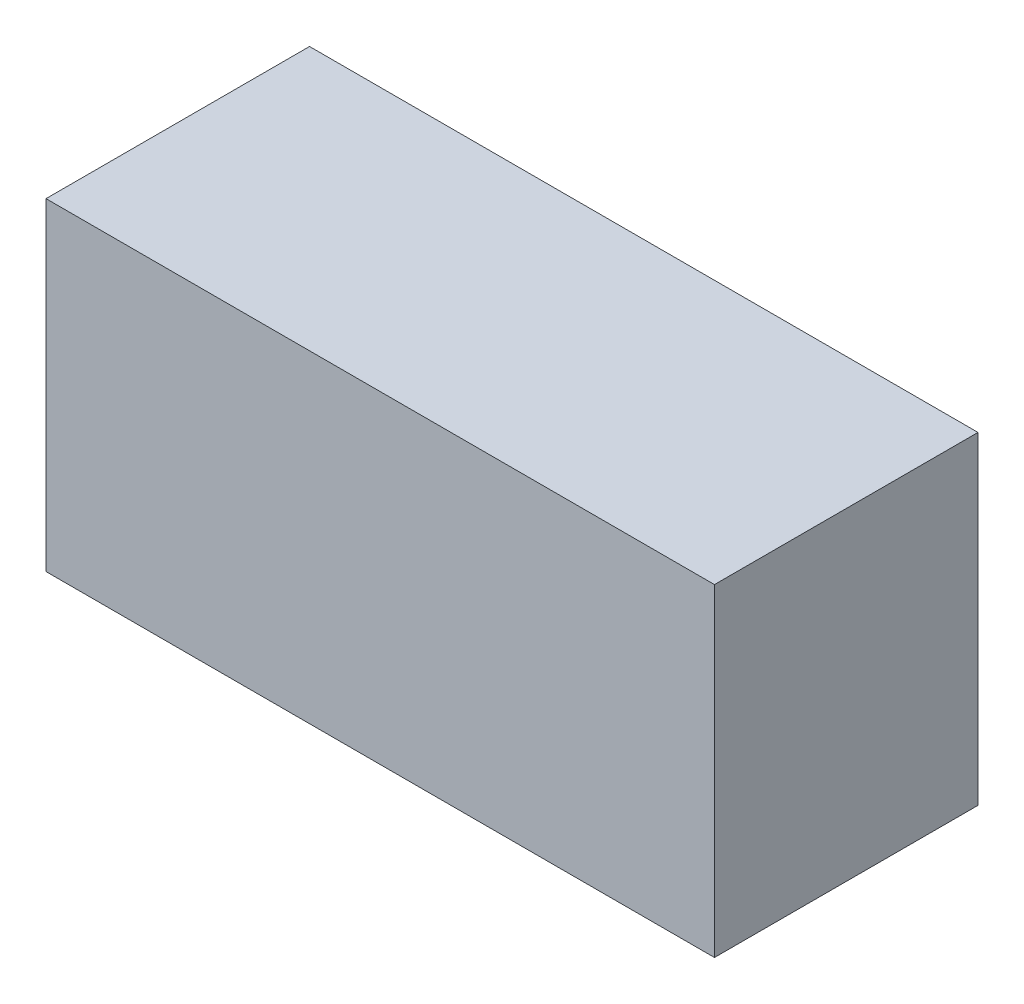
ISO-10303-21;
HEADER;
FILE_DESCRIPTION(('STEP AP214'),'2;1');
FILE_NAME('part.step','',(''),(''),'','','');
FILE_SCHEMA(('AUTOMOTIVE_DESIGN { 1 0 10303 214 1 1 1 1 }'));
ENDSEC;
DATA;
#1=APPLICATION_CONTEXT('core data for automotive mechanical design processes');
#2=APPLICATION_PROTOCOL_DEFINITION('international standard','automotive_design',2000,#1);
#3=PRODUCT_CONTEXT('',#1,'mechanical');
#4=PRODUCT('Part','Part','',(#3));
#5=PRODUCT_RELATED_PRODUCT_CATEGORY('part','',(#4));
#6=PRODUCT_DEFINITION_FORMATION('','',#4);
#7=PRODUCT_DEFINITION_CONTEXT('part definition',#1,'design');
#8=PRODUCT_DEFINITION('design','',#6,#7);
#9=PRODUCT_DEFINITION_SHAPE('','',#8);
#10=(LENGTH_UNIT() NAMED_UNIT(*) SI_UNIT(.MILLI.,.METRE.));
#11=(NAMED_UNIT(*) PLANE_ANGLE_UNIT() SI_UNIT($,.RADIAN.));
#12=(NAMED_UNIT(*) SI_UNIT($,.STERADIAN.) SOLID_ANGLE_UNIT());
#13=UNCERTAINTY_MEASURE_WITH_UNIT(LENGTH_MEASURE(1.E-05),#10,'distance_accuracy_value','');
#14=(GEOMETRIC_REPRESENTATION_CONTEXT(3) GLOBAL_UNCERTAINTY_ASSIGNED_CONTEXT((#13)) GLOBAL_UNIT_ASSIGNED_CONTEXT((#10,
#11,#12)) REPRESENTATION_CONTEXT('',''));
#15=CARTESIAN_POINT('',(0.,0.,0.));
#16=DIRECTION('',(0.,0.,1.));
#17=DIRECTION('',(1.,0.,0.));
#18=AXIS2_PLACEMENT_3D('',#15,#16,#17);
#19=CARTESIAN_POINT('',(0.,10.55,0.));
#20=DIRECTION('',(0.,1.,0.));
#21=DIRECTION('',(1.,0.,0.));
#22=AXIS2_PLACEMENT_3D('',#19,#20,#21);
#23=PLANE('',#22);
#24=DIRECTION('',(1.,0.,0.));
#25=VECTOR('',#24,1.);
#26=CARTESIAN_POINT('',(5.2,10.55,-4.1));
#27=LINE('',#26,#25);
#28=CARTESIAN_POINT('',(-10.4,10.55,-4.1));
#29=VERTEX_POINT('',#28);
#30=CARTESIAN_POINT('',(10.4,10.55,-4.1));
#31=VERTEX_POINT('',#30);
#32=EDGE_CURVE('E106',#29,#31,#27,.T.);
#33=ORIENTED_EDGE('',*,*,#32,.F.);
#34=DIRECTION('',(0.,0.,-1.));
#35=VECTOR('',#34,1.);
#36=CARTESIAN_POINT('',(-10.4,10.55,-2.05));
#37=LINE('',#36,#35);
#38=CARTESIAN_POINT('',(-10.4,10.55,4.1));
#39=VERTEX_POINT('',#38);
#40=EDGE_CURVE('E92',#39,#29,#37,.T.);
#41=ORIENTED_EDGE('',*,*,#40,.F.);
#42=DIRECTION('',(-1.,0.,0.));
#43=VECTOR('',#42,1.);
#44=CARTESIAN_POINT('',(-5.2,10.55,4.1));
#45=LINE('',#44,#43);
#46=CARTESIAN_POINT('',(10.4,10.55,4.1));
#47=VERTEX_POINT('',#46);
#48=EDGE_CURVE('E89',#47,#39,#45,.T.);
#49=ORIENTED_EDGE('',*,*,#48,.F.);
#50=DIRECTION('',(0.,0.,1.));
#51=VECTOR('',#50,1.);
#52=CARTESIAN_POINT('',(10.4,10.55,2.05));
#53=LINE('',#52,#51);
#54=EDGE_CURVE('E26',#31,#47,#53,.T.);
#55=ORIENTED_EDGE('',*,*,#54,.F.);
#56=EDGE_LOOP('',(#33,#41,#49,#55));
#57=FACE_BOUND('',#56,.T.);
#58=ADVANCED_FACE('F16',(#57),#23,.T.);
#59=CARTESIAN_POINT('',(0.,0.5,0.));
#60=DIRECTION('',(0.,1.,0.));
#61=DIRECTION('',(1.,0.,0.));
#62=AXIS2_PLACEMENT_3D('',#59,#60,#61);
#63=PLANE('',#62);
#64=DIRECTION('',(0.,0.,-1.));
#65=VECTOR('',#64,1.);
#66=CARTESIAN_POINT('',(-10.4,0.5,4.1));
#67=LINE('',#66,#65);
#68=CARTESIAN_POINT('',(-10.4,0.5,4.1));
#69=VERTEX_POINT('',#68);
#70=CARTESIAN_POINT('',(-10.4,0.5,-4.1));
#71=VERTEX_POINT('',#70);
#72=EDGE_CURVE('E73',#69,#71,#67,.T.);
#73=ORIENTED_EDGE('',*,*,#72,.T.);
#74=DIRECTION('',(1.,0.,0.));
#75=VECTOR('',#74,1.);
#76=CARTESIAN_POINT('',(-10.4,0.5,-4.1));
#77=LINE('',#76,#75);
#78=CARTESIAN_POINT('',(10.4,0.5,-4.1));
#79=VERTEX_POINT('',#78);
#80=EDGE_CURVE('E20',#71,#79,#77,.T.);
#81=ORIENTED_EDGE('',*,*,#80,.T.);
#82=DIRECTION('',(0.,0.,1.));
#83=VECTOR('',#82,1.);
#84=CARTESIAN_POINT('',(10.4,0.5,-4.1));
#85=LINE('',#84,#83);
#86=CARTESIAN_POINT('',(10.4,0.5,4.1));
#87=VERTEX_POINT('',#86);
#88=EDGE_CURVE('E11',#79,#87,#85,.T.);
#89=ORIENTED_EDGE('',*,*,#88,.T.);
#90=DIRECTION('',(-1.,0.,0.));
#91=VECTOR('',#90,1.);
#92=CARTESIAN_POINT('',(10.4,0.5,4.1));
#93=LINE('',#92,#91);
#94=EDGE_CURVE('E90',#87,#69,#93,.T.);
#95=ORIENTED_EDGE('',*,*,#94,.T.);
#96=EDGE_LOOP('',(#73,#81,#89,#95));
#97=FACE_BOUND('',#96,.T.);
#98=ADVANCED_FACE('F135',(#97),#63,.F.);
#99=CARTESIAN_POINT('',(10.4,0.5,4.1));
#100=DIRECTION('',(1.,0.,0.));
#101=DIRECTION('',(0.,1.,0.));
#102=AXIS2_PLACEMENT_3D('',#99,#100,#101);
#103=PLANE('',#102);
#104=ORIENTED_EDGE('',*,*,#54,.T.);
#105=DIRECTION('',(0.,1.,0.));
#106=VECTOR('',#105,1.);
#107=CARTESIAN_POINT('',(10.4,0.5,4.1));
#108=LINE('',#107,#106);
#109=EDGE_CURVE('E78',#87,#47,#108,.T.);
#110=ORIENTED_EDGE('',*,*,#109,.F.);
#111=ORIENTED_EDGE('',*,*,#88,.F.);
#112=DIRECTION('',(0.,1.,0.));
#113=VECTOR('',#112,1.);
#114=CARTESIAN_POINT('',(10.4,0.5,-4.1));
#115=LINE('',#114,#113);
#116=EDGE_CURVE('E81',#79,#31,#115,.T.);
#117=ORIENTED_EDGE('',*,*,#116,.T.);
#118=EDGE_LOOP('',(#104,#110,#111,#117));
#119=FACE_BOUND('',#118,.T.);
#120=ADVANCED_FACE('F18',(#119),#103,.T.);
#121=CARTESIAN_POINT('',(10.4,0.5,-4.1));
#122=DIRECTION('',(0.,0.,-1.));
#123=DIRECTION('',(0.,-1.,0.));
#124=AXIS2_PLACEMENT_3D('',#121,#122,#123);
#125=PLANE('',#124);
#126=ORIENTED_EDGE('',*,*,#32,.T.);
#127=ORIENTED_EDGE('',*,*,#116,.F.);
#128=ORIENTED_EDGE('',*,*,#80,.F.);
#129=DIRECTION('',(0.,1.,0.));
#130=VECTOR('',#129,1.);
#131=CARTESIAN_POINT('',(-10.4,0.5,-4.1));
#132=LINE('',#131,#130);
#133=EDGE_CURVE('E108',#71,#29,#132,.T.);
#134=ORIENTED_EDGE('',*,*,#133,.T.);
#135=EDGE_LOOP('',(#126,#127,#128,#134));
#136=FACE_BOUND('',#135,.T.);
#137=ADVANCED_FACE('F125',(#136),#125,.T.);
#138=CARTESIAN_POINT('',(-10.4,0.5,-4.1));
#139=DIRECTION('',(-1.,0.,0.));
#140=DIRECTION('',(0.,0.,1.));
#141=AXIS2_PLACEMENT_3D('',#138,#139,#140);
#142=PLANE('',#141);
#143=ORIENTED_EDGE('',*,*,#40,.T.);
#144=ORIENTED_EDGE('',*,*,#133,.F.);
#145=ORIENTED_EDGE('',*,*,#72,.F.);
#146=DIRECTION('',(0.,1.,0.));
#147=VECTOR('',#146,1.);
#148=CARTESIAN_POINT('',(-10.4,0.5,4.1));
#149=LINE('',#148,#147);
#150=EDGE_CURVE('E96',#69,#39,#149,.T.);
#151=ORIENTED_EDGE('',*,*,#150,.T.);
#152=EDGE_LOOP('',(#143,#144,#145,#151));
#153=FACE_BOUND('',#152,.T.);
#154=ADVANCED_FACE('F123',(#153),#142,.T.);
#155=CARTESIAN_POINT('',(-10.4,0.5,4.1));
#156=DIRECTION('',(0.,0.,1.));
#157=DIRECTION('',(1.,0.,0.));
#158=AXIS2_PLACEMENT_3D('',#155,#156,#157);
#159=PLANE('',#158);
#160=ORIENTED_EDGE('',*,*,#48,.T.);
#161=ORIENTED_EDGE('',*,*,#150,.F.);
#162=ORIENTED_EDGE('',*,*,#94,.F.);
#163=ORIENTED_EDGE('',*,*,#109,.T.);
#164=EDGE_LOOP('',(#160,#161,#162,#163));
#165=FACE_BOUND('',#164,.T.);
#166=ADVANCED_FACE('F87',(#165),#159,.T.);
#167=CLOSED_SHELL('',(#58,#98,#120,#137,#154,#166));
#168=MANIFOLD_SOLID_BREP('B1',#167);
#169=ADVANCED_BREP_SHAPE_REPRESENTATION('',(#18,#168),#14);
#170=SHAPE_DEFINITION_REPRESENTATION(#9,#169);
ENDSEC;
END-ISO-10303-21;
